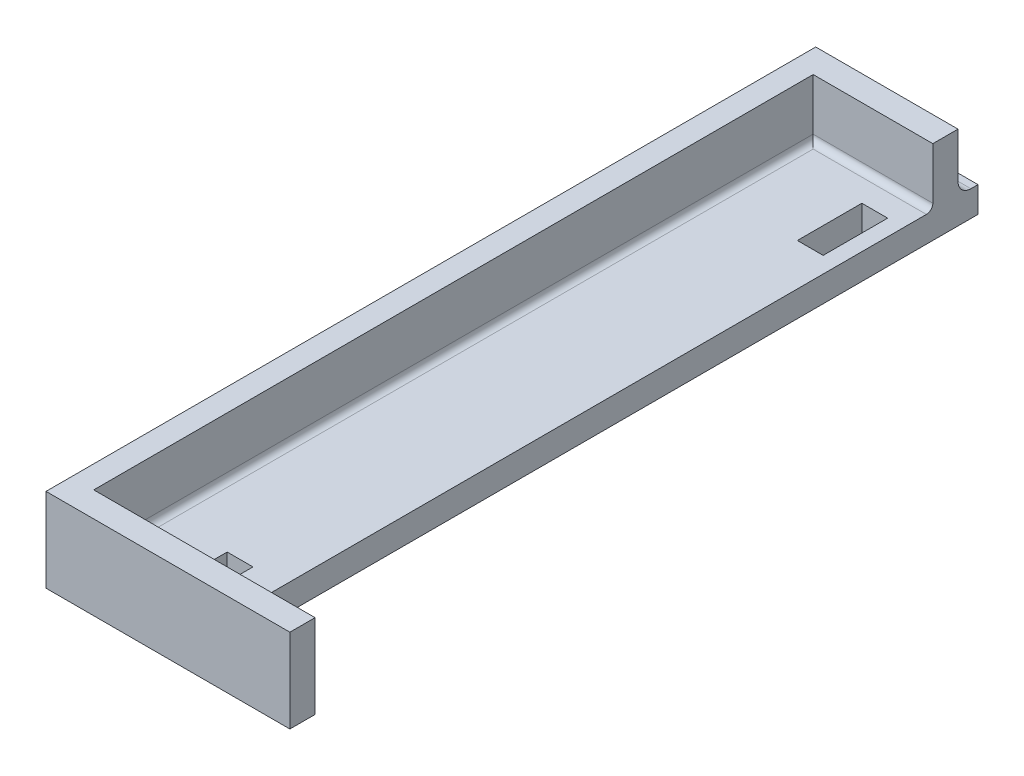
ISO-10303-21;
HEADER;
FILE_DESCRIPTION(('STEP AP214'),'2;1');
FILE_NAME('part.step','',(''),(''),'','','');
FILE_SCHEMA(('AUTOMOTIVE_DESIGN { 1 0 10303 214 1 1 1 1 }'));
ENDSEC;
DATA;
#1=APPLICATION_CONTEXT('core data for automotive mechanical design processes');
#2=APPLICATION_PROTOCOL_DEFINITION('international standard','automotive_design',2000,#1);
#3=PRODUCT_CONTEXT('',#1,'mechanical');
#4=PRODUCT('Part','Part','',(#3));
#5=PRODUCT_RELATED_PRODUCT_CATEGORY('part','',(#4));
#6=PRODUCT_DEFINITION_FORMATION('','',#4);
#7=PRODUCT_DEFINITION_CONTEXT('part definition',#1,'design');
#8=PRODUCT_DEFINITION('design','',#6,#7);
#9=PRODUCT_DEFINITION_SHAPE('','',#8);
#10=(LENGTH_UNIT() NAMED_UNIT(*) SI_UNIT(.MILLI.,.METRE.));
#11=(NAMED_UNIT(*) PLANE_ANGLE_UNIT() SI_UNIT($,.RADIAN.));
#12=(NAMED_UNIT(*) SI_UNIT($,.STERADIAN.) SOLID_ANGLE_UNIT());
#13=UNCERTAINTY_MEASURE_WITH_UNIT(LENGTH_MEASURE(1.E-05),#10,'distance_accuracy_value','');
#14=(GEOMETRIC_REPRESENTATION_CONTEXT(3) GLOBAL_UNCERTAINTY_ASSIGNED_CONTEXT((#13)) GLOBAL_UNIT_ASSIGNED_CONTEXT((#10,
#11,#12)) REPRESENTATION_CONTEXT('',''));
#15=CARTESIAN_POINT('',(0.,0.,0.));
#16=DIRECTION('',(0.,0.,1.));
#17=DIRECTION('',(1.,0.,0.));
#18=AXIS2_PLACEMENT_3D('',#15,#16,#17);
#19=CARTESIAN_POINT('',(-15.75,-4.,-132.4));
#20=DIRECTION('',(1.,0.,0.));
#21=DIRECTION('',(0.,0.,1.));
#22=AXIS2_PLACEMENT_3D('',#19,#20,#21);
#23=PLANE('',#22);
#24=DIRECTION('',(0.,0.,1.));
#25=VECTOR('',#24,1.);
#26=CARTESIAN_POINT('',(-15.75,0.,-132.4));
#27=LINE('',#26,#25);
#28=CARTESIAN_POINT('',(-15.75,0.,-122.4));
#29=VERTEX_POINT('',#28);
#30=CARTESIAN_POINT('',(-15.75,0.,-121.3));
#31=VERTEX_POINT('',#30);
#32=EDGE_CURVE('E189',#29,#31,#27,.T.);
#33=ORIENTED_EDGE('',*,*,#32,.T.);
#34=CARTESIAN_POINT('',(-15.75,2.,-121.3));
#35=DIRECTION('',(-1.,0.,0.));
#36=DIRECTION('',(0.,0.,1.));
#37=AXIS2_PLACEMENT_3D('',#34,#35,#36);
#38=CIRCLE('',#37,2.);
#39=CARTESIAN_POINT('',(-15.75,2.,-119.3));
#40=VERTEX_POINT('',#39);
#41=EDGE_CURVE('E229',#31,#40,#38,.T.);
#42=ORIENTED_EDGE('',*,*,#41,.T.);
#43=DIRECTION('',(0.,-1.,0.));
#44=VECTOR('',#43,1.);
#45=CARTESIAN_POINT('',(-15.75,9.,-119.3));
#46=LINE('',#45,#44);
#47=CARTESIAN_POINT('',(-15.75,9.,-119.3));
#48=VERTEX_POINT('',#47);
#49=EDGE_CURVE('E208',#48,#40,#46,.T.);
#50=ORIENTED_EDGE('',*,*,#49,.F.);
#51=DIRECTION('',(0.,0.,1.));
#52=VECTOR('',#51,1.);
#53=CARTESIAN_POINT('',(-15.75,9.,-115.4));
#54=LINE('',#53,#52);
#55=CARTESIAN_POINT('',(-15.75,9.,-115.4));
#56=VERTEX_POINT('',#55);
#57=EDGE_CURVE('E321',#48,#56,#54,.T.);
#58=ORIENTED_EDGE('',*,*,#57,.T.);
#59=DIRECTION('',(0.,-1.,0.));
#60=VECTOR('',#59,1.);
#61=CARTESIAN_POINT('',(-15.75,9.,-115.4));
#62=LINE('',#61,#60);
#63=CARTESIAN_POINT('',(-15.75,1.,-115.4));
#64=VERTEX_POINT('',#63);
#65=EDGE_CURVE('E282',#56,#64,#62,.T.);
#66=ORIENTED_EDGE('',*,*,#65,.T.);
#67=CARTESIAN_POINT('',(-15.75,1.,-114.4));
#68=DIRECTION('',(-1.,0.,0.));
#69=DIRECTION('',(0.,0.,1.));
#70=AXIS2_PLACEMENT_3D('',#67,#68,#69);
#71=CIRCLE('',#70,1.);
#72=CARTESIAN_POINT('',(-15.75,0.,-114.4));
#73=VERTEX_POINT('',#72);
#74=EDGE_CURVE('E43',#64,#73,#71,.T.);
#75=ORIENTED_EDGE('',*,*,#74,.T.);
#76=CARTESIAN_POINT('',(-15.75,0.,-4.90000000000002));
#77=VERTEX_POINT('',#76);
#78=EDGE_CURVE('E203',#73,#77,#27,.T.);
#79=ORIENTED_EDGE('',*,*,#78,.T.);
#80=CARTESIAN_POINT('',(-15.75,1.,-4.9));
#81=DIRECTION('',(-1.,0.,0.));
#82=DIRECTION('',(0.,0.,1.));
#83=AXIS2_PLACEMENT_3D('',#80,#81,#82);
#84=CIRCLE('',#83,1.);
#85=CARTESIAN_POINT('',(-15.75,1.,-3.90000000000001));
#86=VERTEX_POINT('',#85);
#87=EDGE_CURVE('E269',#77,#86,#84,.T.);
#88=ORIENTED_EDGE('',*,*,#87,.T.);
#89=DIRECTION('',(0.,1.,0.));
#90=VECTOR('',#89,1.);
#91=CARTESIAN_POINT('',(-15.75,-4.,-3.9));
#92=LINE('',#91,#90);
#93=CARTESIAN_POINT('',(-15.75,-4.,-3.9));
#94=VERTEX_POINT('',#93);
#95=EDGE_CURVE('E297',#94,#86,#92,.T.);
#96=ORIENTED_EDGE('',*,*,#95,.F.);
#97=DIRECTION('',(0.,0.,1.));
#98=VECTOR('',#97,1.);
#99=CARTESIAN_POINT('',(-15.75,-4.,-132.4));
#100=LINE('',#99,#98);
#101=CARTESIAN_POINT('',(-15.75,-4.,-122.4));
#102=VERTEX_POINT('',#101);
#103=EDGE_CURVE('E299',#102,#94,#100,.T.);
#104=ORIENTED_EDGE('',*,*,#103,.F.);
#105=DIRECTION('',(0.,-1.,0.));
#106=VECTOR('',#105,1.);
#107=CARTESIAN_POINT('',(-15.75,-4.,-122.4));
#108=LINE('',#107,#106);
#109=EDGE_CURVE('E197',#29,#102,#108,.T.);
#110=ORIENTED_EDGE('',*,*,#109,.F.);
#111=EDGE_LOOP('',(#33,#42,#50,#58,#66,#75,#79,#88,#96,#104,#110));
#112=FACE_BOUND('',#111,.T.);
#113=ADVANCED_FACE('F35',(#112),#23,.T.);
#114=CARTESIAN_POINT('',(-37.8,-4.,-129.4));
#115=DIRECTION('',(-1.,0.,0.));
#116=DIRECTION('',(0.,0.,-1.));
#117=AXIS2_PLACEMENT_3D('',#114,#115,#116);
#118=PLANE('',#117);
#119=DIRECTION('',(0.,0.,-1.));
#120=VECTOR('',#119,1.);
#121=CARTESIAN_POINT('',(-37.8,-4.,0.));
#122=LINE('',#121,#120);
#123=CARTESIAN_POINT('',(-37.8,-4.,0.));
#124=VERTEX_POINT('',#123);
#125=CARTESIAN_POINT('',(-37.8,-4.,-122.4));
#126=VERTEX_POINT('',#125);
#127=EDGE_CURVE('E336',#124,#126,#122,.T.);
#128=ORIENTED_EDGE('',*,*,#127,.F.);
#129=DIRECTION('',(0.,1.,0.));
#130=VECTOR('',#129,1.);
#131=CARTESIAN_POINT('',(-37.8,-4.,0.));
#132=LINE('',#131,#130);
#133=CARTESIAN_POINT('',(-37.8,9.,0.));
#134=VERTEX_POINT('',#133);
#135=EDGE_CURVE('E222',#124,#134,#132,.T.);
#136=ORIENTED_EDGE('',*,*,#135,.T.);
#137=DIRECTION('',(0.,0.,-1.));
#138=VECTOR('',#137,1.);
#139=CARTESIAN_POINT('',(-37.8,9.,-119.3));
#140=LINE('',#139,#138);
#141=CARTESIAN_POINT('',(-37.8,9.,-119.3));
#142=VERTEX_POINT('',#141);
#143=EDGE_CURVE('E316',#134,#142,#140,.T.);
#144=ORIENTED_EDGE('',*,*,#143,.T.);
#145=DIRECTION('',(0.,-1.,0.));
#146=VECTOR('',#145,1.);
#147=CARTESIAN_POINT('',(-37.8,9.,-119.3));
#148=LINE('',#147,#146);
#149=CARTESIAN_POINT('',(-37.8,2.,-119.3));
#150=VERTEX_POINT('',#149);
#151=EDGE_CURVE('E204',#142,#150,#148,.T.);
#152=ORIENTED_EDGE('',*,*,#151,.T.);
#153=CARTESIAN_POINT('',(-37.8,2.,-121.3));
#154=DIRECTION('',(1.,0.,0.));
#155=DIRECTION('',(0.,0.,-1.));
#156=AXIS2_PLACEMENT_3D('',#153,#154,#155);
#157=CIRCLE('',#156,2.);
#158=CARTESIAN_POINT('',(-37.8,0.,-121.3));
#159=VERTEX_POINT('',#158);
#160=EDGE_CURVE('E202',#150,#159,#157,.T.);
#161=ORIENTED_EDGE('',*,*,#160,.T.);
#162=DIRECTION('',(0.,0.,-1.));
#163=VECTOR('',#162,1.);
#164=CARTESIAN_POINT('',(-37.8,0.,-129.4));
#165=LINE('',#164,#163);
#166=CARTESIAN_POINT('',(-37.8,0.,-122.4));
#167=VERTEX_POINT('',#166);
#168=EDGE_CURVE('E186',#159,#167,#165,.T.);
#169=ORIENTED_EDGE('',*,*,#168,.T.);
#170=DIRECTION('',(0.,1.,0.));
#171=VECTOR('',#170,1.);
#172=CARTESIAN_POINT('',(-37.8,-4.,-122.4));
#173=LINE('',#172,#171);
#174=EDGE_CURVE('E191',#126,#167,#173,.T.);
#175=ORIENTED_EDGE('',*,*,#174,.F.);
#176=EDGE_LOOP('',(#128,#136,#144,#152,#161,#169,#175));
#177=FACE_BOUND('',#176,.T.);
#178=ADVANCED_FACE('F199',(#177),#118,.T.);
#179=CARTESIAN_POINT('',(0.,-4.,0.));
#180=DIRECTION('',(0.,1.,0.));
#181=DIRECTION('',(0.,0.,1.));
#182=AXIS2_PLACEMENT_3D('',#179,#180,#181);
#183=PLANE('',#182);
#184=DIRECTION('',(1.,0.,0.));
#185=VECTOR('',#184,1.);
#186=CARTESIAN_POINT('',(0.,-4.,-14.9));
#187=LINE('',#186,#185);
#188=CARTESIAN_POINT('',(-24.6202204130949,-4.,-14.9));
#189=VERTEX_POINT('',#188);
#190=CARTESIAN_POINT('',(-20.6202204130949,-4.,-14.9));
#191=VERTEX_POINT('',#190);
#192=EDGE_CURVE('E238',#189,#191,#187,.T.);
#193=ORIENTED_EDGE('',*,*,#192,.F.);
#194=DIRECTION('',(-4.42680325529367E-05,0.,-0.999999999020171));
#195=VECTOR('',#194,1.);
#196=CARTESIAN_POINT('',(-24.6195607711632,-4.,0.00108985951872473));
#197=LINE('',#196,#195);
#198=CARTESIAN_POINT('',(-24.6197795869051,-4.,-4.9418843150546));
#199=VERTEX_POINT('',#198);
#200=EDGE_CURVE('E235',#199,#189,#197,.T.);
#201=ORIENTED_EDGE('',*,*,#200,.F.);
#202=DIRECTION('',(-1.,0.,0.));
#203=VECTOR('',#202,1.);
#204=CARTESIAN_POINT('',(0.,-4.,-4.9418843150546));
#205=LINE('',#204,#203);
#206=CARTESIAN_POINT('',(-20.6197795869051,-4.,-4.9418843150546));
#207=VERTEX_POINT('',#206);
#208=EDGE_CURVE('E232',#207,#199,#205,.T.);
#209=ORIENTED_EDGE('',*,*,#208,.F.);
#210=DIRECTION('',(4.42680325529367E-05,0.,0.999999999020171));
#211=VECTOR('',#210,1.);
#212=CARTESIAN_POINT('',(-20.6195607790019,-4.,0.000912787388686487));
#213=LINE('',#212,#211);
#214=EDGE_CURVE('E241',#191,#207,#213,.T.);
#215=ORIENTED_EDGE('',*,*,#214,.F.);
#216=EDGE_LOOP('',(#193,#201,#209,#215));
#217=FACE_BOUND('',#216,.T.);
#218=DIRECTION('',(-1.,0.,0.));
#219=VECTOR('',#218,1.);
#220=CARTESIAN_POINT('',(0.,-4.,-100.9));
#221=LINE('',#220,#219);
#222=CARTESIAN_POINT('',(-18.25,-4.,-100.9));
#223=VERTEX_POINT('',#222);
#224=CARTESIAN_POINT('',(-22.25,-4.,-100.9));
#225=VERTEX_POINT('',#224);
#226=EDGE_CURVE('E250',#223,#225,#221,.T.);
#227=ORIENTED_EDGE('',*,*,#226,.F.);
#228=DIRECTION('',(0.,0.,1.));
#229=VECTOR('',#228,1.);
#230=CARTESIAN_POINT('',(-18.25,-4.,0.));
#231=LINE('',#230,#229);
#232=CARTESIAN_POINT('',(-18.25,-4.,-110.9));
#233=VERTEX_POINT('',#232);
#234=EDGE_CURVE('E247',#233,#223,#231,.T.);
#235=ORIENTED_EDGE('',*,*,#234,.F.);
#236=DIRECTION('',(1.,0.,0.));
#237=VECTOR('',#236,1.);
#238=CARTESIAN_POINT('',(0.,-4.,-110.9));
#239=LINE('',#238,#237);
#240=CARTESIAN_POINT('',(-22.25,-4.,-110.9));
#241=VERTEX_POINT('',#240);
#242=EDGE_CURVE('E244',#241,#233,#239,.T.);
#243=ORIENTED_EDGE('',*,*,#242,.F.);
#244=DIRECTION('',(0.,0.,-1.));
#245=VECTOR('',#244,1.);
#246=CARTESIAN_POINT('',(-22.25,-4.,0.));
#247=LINE('',#246,#245);
#248=EDGE_CURVE('E253',#225,#241,#247,.T.);
#249=ORIENTED_EDGE('',*,*,#248,.F.);
#250=EDGE_LOOP('',(#227,#235,#243,#249));
#251=FACE_BOUND('',#250,.T.);
#252=DIRECTION('',(1.,0.,0.));
#253=VECTOR('',#252,1.);
#254=CARTESIAN_POINT('',(0.,-4.,-122.4));
#255=LINE('',#254,#253);
#256=EDGE_CURVE('E193',#126,#102,#255,.T.);
#257=ORIENTED_EDGE('',*,*,#256,.T.);
#258=ORIENTED_EDGE('',*,*,#103,.T.);
#259=DIRECTION('',(1.,0.,0.));
#260=VECTOR('',#259,1.);
#261=CARTESIAN_POINT('',(0.,-4.,-3.9));
#262=LINE('',#261,#260);
#263=CARTESIAN_POINT('',(0.,-4.,-3.9));
#264=VERTEX_POINT('',#263);
#265=EDGE_CURVE('E338',#94,#264,#262,.T.);
#266=ORIENTED_EDGE('',*,*,#265,.T.);
#267=DIRECTION('',(0.,0.,1.));
#268=VECTOR('',#267,1.);
#269=CARTESIAN_POINT('',(0.,-4.,0.));
#270=LINE('',#269,#268);
#271=CARTESIAN_POINT('',(0.,-4.,0.));
#272=VERTEX_POINT('',#271);
#273=EDGE_CURVE('E211',#264,#272,#270,.T.);
#274=ORIENTED_EDGE('',*,*,#273,.T.);
#275=DIRECTION('',(-1.,0.,0.));
#276=VECTOR('',#275,1.);
#277=CARTESIAN_POINT('',(0.,-4.,0.));
#278=LINE('',#277,#276);
#279=EDGE_CURVE('E214',#272,#124,#278,.T.);
#280=ORIENTED_EDGE('',*,*,#279,.T.);
#281=ORIENTED_EDGE('',*,*,#127,.T.);
#282=EDGE_LOOP('',(#257,#258,#266,#274,#280,#281));
#283=FACE_BOUND('',#282,.T.);
#284=ADVANCED_FACE('F343',(#217,#251,#283),#183,.F.);
#285=CARTESIAN_POINT('',(0.,0.,0.));
#286=DIRECTION('',(0.,1.,0.));
#287=DIRECTION('',(0.,0.,1.));
#288=AXIS2_PLACEMENT_3D('',#285,#286,#287);
#289=PLANE('',#288);
#290=ORIENTED_EDGE('',*,*,#168,.F.);
#291=DIRECTION('',(1.,0.,0.));
#292=VECTOR('',#291,1.);
#293=CARTESIAN_POINT('',(0.,0.,-121.3));
#294=LINE('',#293,#292);
#295=EDGE_CURVE('E226',#31,#159,#294,.F.);
#296=ORIENTED_EDGE('',*,*,#295,.F.);
#297=ORIENTED_EDGE('',*,*,#32,.F.);
#298=DIRECTION('',(1.,0.,0.));
#299=VECTOR('',#298,1.);
#300=CARTESIAN_POINT('',(0.,0.,-122.4));
#301=LINE('',#300,#299);
#302=EDGE_CURVE('E11',#167,#29,#301,.T.);
#303=ORIENTED_EDGE('',*,*,#302,.F.);
#304=EDGE_LOOP('',(#290,#296,#297,#303));
#305=FACE_BOUND('',#304,.T.);
#306=ADVANCED_FACE('F184',(#305),#289,.T.);
#307=CARTESIAN_POINT('',(-33.3,1.,0.));
#308=DIRECTION('',(0.,0.,-1.));
#309=DIRECTION('',(1.,0.,0.));
#310=AXIS2_PLACEMENT_3D('',#307,#308,#309);
#311=CYLINDRICAL_SURFACE('',#310,1.);
#312=CARTESIAN_POINT('',(-33.3,1.,-114.4));
#313=DIRECTION('',(-0.707106781186548,0.,0.707106781186547));
#314=DIRECTION('',(-0.707106781186547,0.,-0.707106781186548));
#315=AXIS2_PLACEMENT_3D('',#312,#313,#314);
#316=ELLIPSE('',#315,1.41421356237309,1.);
#317=CARTESIAN_POINT('',(-33.3,0.,-114.4));
#318=VERTEX_POINT('',#317);
#319=CARTESIAN_POINT('',(-34.3,1.,-115.4));
#320=VERTEX_POINT('',#319);
#321=EDGE_CURVE('E275',#318,#320,#316,.F.);
#322=ORIENTED_EDGE('',*,*,#321,.T.);
#323=DIRECTION('',(0.,0.,-1.));
#324=VECTOR('',#323,1.);
#325=CARTESIAN_POINT('',(-34.3,0.999999999999999,-115.4));
#326=LINE('',#325,#324);
#327=CARTESIAN_POINT('',(-34.3,1.,-3.9));
#328=VERTEX_POINT('',#327);
#329=EDGE_CURVE('E265',#320,#328,#326,.F.);
#330=ORIENTED_EDGE('',*,*,#329,.T.);
#331=CARTESIAN_POINT('',(-33.3,1.,-4.9));
#332=DIRECTION('',(-0.707106781186547,0.,-0.707106781186548));
#333=DIRECTION('',(0.707106781186548,0.,-0.707106781186547));
#334=AXIS2_PLACEMENT_3D('',#331,#332,#333);
#335=ELLIPSE('',#334,1.4142135623731,1.);
#336=CARTESIAN_POINT('',(-33.3,0.,-4.9));
#337=VERTEX_POINT('',#336);
#338=EDGE_CURVE('E272',#337,#328,#335,.T.);
#339=ORIENTED_EDGE('',*,*,#338,.F.);
#340=DIRECTION('',(0.,0.,-1.));
#341=VECTOR('',#340,1.);
#342=CARTESIAN_POINT('',(-33.3,0.,0.));
#343=LINE('',#342,#341);
#344=EDGE_CURVE('E258',#337,#318,#343,.T.);
#345=ORIENTED_EDGE('',*,*,#344,.T.);
#346=EDGE_LOOP('',(#322,#330,#339,#345));
#347=FACE_BOUND('',#346,.T.);
#348=ADVANCED_FACE('F433',(#347),#311,.F.);
#349=CARTESIAN_POINT('',(0.,1.,-4.9));
#350=DIRECTION('',(1.,0.,0.));
#351=DIRECTION('',(0.,0.,1.));
#352=AXIS2_PLACEMENT_3D('',#349,#350,#351);
#353=CYLINDRICAL_SURFACE('',#352,1.);
#354=ORIENTED_EDGE('',*,*,#338,.T.);
#355=DIRECTION('',(-1.,0.,0.));
#356=VECTOR('',#355,1.);
#357=CARTESIAN_POINT('',(0.,1.,-3.9));
#358=LINE('',#357,#356);
#359=EDGE_CURVE('E263',#328,#86,#358,.F.);
#360=ORIENTED_EDGE('',*,*,#359,.T.);
#361=ORIENTED_EDGE('',*,*,#87,.F.);
#362=DIRECTION('',(-1.,0.,0.));
#363=VECTOR('',#362,1.);
#364=CARTESIAN_POINT('',(0.,0.,-4.9));
#365=LINE('',#364,#363);
#366=EDGE_CURVE('E261',#77,#337,#365,.T.);
#367=ORIENTED_EDGE('',*,*,#366,.T.);
#368=EDGE_LOOP('',(#354,#360,#361,#367));
#369=FACE_BOUND('',#368,.T.);
#370=ADVANCED_FACE('F292',(#369),#353,.F.);
#371=CARTESIAN_POINT('',(0.,1.,-114.4));
#372=DIRECTION('',(1.,0.,0.));
#373=DIRECTION('',(0.,0.,1.));
#374=AXIS2_PLACEMENT_3D('',#371,#372,#373);
#375=CYLINDRICAL_SURFACE('',#374,1.);
#376=DIRECTION('',(1.,0.,0.));
#377=VECTOR('',#376,1.);
#378=CARTESIAN_POINT('',(0.,0.,-114.4));
#379=LINE('',#378,#377);
#380=EDGE_CURVE('E256',#318,#73,#379,.T.);
#381=ORIENTED_EDGE('',*,*,#380,.T.);
#382=ORIENTED_EDGE('',*,*,#74,.F.);
#383=DIRECTION('',(1.,0.,0.));
#384=VECTOR('',#383,1.);
#385=CARTESIAN_POINT('',(-34.3,0.999999999999999,-115.4));
#386=LINE('',#385,#384);
#387=EDGE_CURVE('E56',#64,#320,#386,.F.);
#388=ORIENTED_EDGE('',*,*,#387,.T.);
#389=ORIENTED_EDGE('',*,*,#321,.F.);
#390=EDGE_LOOP('',(#381,#382,#388,#389));
#391=FACE_BOUND('',#390,.T.);
#392=ADVANCED_FACE('F37',(#391),#375,.F.);
#393=CARTESIAN_POINT('',(0.,-4.,-3.9));
#394=DIRECTION('',(0.,0.,-1.));
#395=DIRECTION('',(1.,0.,0.));
#396=AXIS2_PLACEMENT_3D('',#393,#394,#395);
#397=PLANE('',#396);
#398=DIRECTION('',(0.,-1.,0.));
#399=VECTOR('',#398,1.);
#400=CARTESIAN_POINT('',(-34.3,9.,-3.9));
#401=LINE('',#400,#399);
#402=CARTESIAN_POINT('',(-34.3,9.,-3.9));
#403=VERTEX_POINT('',#402);
#404=EDGE_CURVE('E328',#403,#328,#401,.T.);
#405=ORIENTED_EDGE('',*,*,#404,.F.);
#406=DIRECTION('',(1.,0.,0.));
#407=VECTOR('',#406,1.);
#408=CARTESIAN_POINT('',(-34.3,9.,-3.9));
#409=LINE('',#408,#407);
#410=CARTESIAN_POINT('',(0.,9.,-3.9));
#411=VERTEX_POINT('',#410);
#412=EDGE_CURVE('E301',#403,#411,#409,.T.);
#413=ORIENTED_EDGE('',*,*,#412,.T.);
#414=DIRECTION('',(0.,1.,0.));
#415=VECTOR('',#414,1.);
#416=CARTESIAN_POINT('',(0.,-4.,-3.9));
#417=LINE('',#416,#415);
#418=EDGE_CURVE('E219',#264,#411,#417,.T.);
#419=ORIENTED_EDGE('',*,*,#418,.F.);
#420=ORIENTED_EDGE('',*,*,#265,.F.);
#421=ORIENTED_EDGE('',*,*,#95,.T.);
#422=ORIENTED_EDGE('',*,*,#359,.F.);
#423=EDGE_LOOP('',(#405,#413,#419,#420,#421,#422));
#424=FACE_BOUND('',#423,.T.);
#425=ADVANCED_FACE('F423',(#424),#397,.T.);
#426=CARTESIAN_POINT('',(-15.75,2.,-121.3));
#427=DIRECTION('',(1.,0.,0.));
#428=DIRECTION('',(0.,0.,1.));
#429=AXIS2_PLACEMENT_3D('',#426,#427,#428);
#430=CYLINDRICAL_SURFACE('',#429,2.);
#431=DIRECTION('',(1.,0.,0.));
#432=VECTOR('',#431,1.);
#433=CARTESIAN_POINT('',(-15.75,2.,-119.3));
#434=LINE('',#433,#432);
#435=EDGE_CURVE('E218',#150,#40,#434,.T.);
#436=ORIENTED_EDGE('',*,*,#435,.T.);
#437=ORIENTED_EDGE('',*,*,#41,.F.);
#438=ORIENTED_EDGE('',*,*,#295,.T.);
#439=ORIENTED_EDGE('',*,*,#160,.F.);
#440=EDGE_LOOP('',(#436,#437,#438,#439));
#441=FACE_BOUND('',#440,.T.);
#442=ADVANCED_FACE('F428',(#441),#430,.F.);
#443=DIRECTION('',(0.,0.,-1.));
#444=VECTOR('',#443,1.);
#445=CARTESIAN_POINT('',(-22.25,0.,-110.9));
#446=LINE('',#445,#444);
#447=CARTESIAN_POINT('',(-22.25,0.,-100.9));
#448=VERTEX_POINT('',#447);
#449=CARTESIAN_POINT('',(-22.25,0.,-110.9));
#450=VERTEX_POINT('',#449);
#451=EDGE_CURVE('E356',#448,#450,#446,.T.);
#452=ORIENTED_EDGE('',*,*,#451,.T.);
#453=DIRECTION('',(1.,0.,0.));
#454=VECTOR('',#453,1.);
#455=CARTESIAN_POINT('',(-18.25,0.,-110.9));
#456=LINE('',#455,#454);
#457=CARTESIAN_POINT('',(-18.25,0.,-110.9));
#458=VERTEX_POINT('',#457);
#459=EDGE_CURVE('E359',#450,#458,#456,.T.);
#460=ORIENTED_EDGE('',*,*,#459,.T.);
#461=DIRECTION('',(0.,0.,1.));
#462=VECTOR('',#461,1.);
#463=CARTESIAN_POINT('',(-18.25,0.,-100.9));
#464=LINE('',#463,#462);
#465=CARTESIAN_POINT('',(-18.25,0.,-100.9));
#466=VERTEX_POINT('',#465);
#467=EDGE_CURVE('E363',#458,#466,#464,.T.);
#468=ORIENTED_EDGE('',*,*,#467,.T.);
#469=DIRECTION('',(-1.,0.,0.));
#470=VECTOR('',#469,1.);
#471=CARTESIAN_POINT('',(-18.25,0.,-100.9));
#472=LINE('',#471,#470);
#473=EDGE_CURVE('E366',#466,#448,#472,.T.);
#474=ORIENTED_EDGE('',*,*,#473,.T.);
#475=EDGE_LOOP('',(#452,#460,#468,#474));
#476=FACE_BOUND('',#475,.T.);
#477=DIRECTION('',(4.42680325529367E-05,0.,0.999999999020171));
#478=VECTOR('',#477,1.);
#479=CARTESIAN_POINT('',(-20.6197795869051,0.,-4.9418843150546));
#480=LINE('',#479,#478);
#481=CARTESIAN_POINT('',(-20.6202204130949,0.,-14.9));
#482=VERTEX_POINT('',#481);
#483=CARTESIAN_POINT('',(-20.6197795869051,0.,-4.9418843150546));
#484=VERTEX_POINT('',#483);
#485=EDGE_CURVE('E352',#482,#484,#480,.T.);
#486=ORIENTED_EDGE('',*,*,#485,.T.);
#487=DIRECTION('',(-1.,0.,0.));
#488=VECTOR('',#487,1.);
#489=CARTESIAN_POINT('',(-24.6197795869051,0.,-4.9418843150546));
#490=LINE('',#489,#488);
#491=CARTESIAN_POINT('',(-24.6197795869051,0.,-4.9418843150546));
#492=VERTEX_POINT('',#491);
#493=EDGE_CURVE('E376',#484,#492,#490,.T.);
#494=ORIENTED_EDGE('',*,*,#493,.T.);
#495=DIRECTION('',(-4.42680325529367E-05,0.,-0.999999999020171));
#496=VECTOR('',#495,1.);
#497=CARTESIAN_POINT('',(-24.6202204130949,0.,-14.9));
#498=LINE('',#497,#496);
#499=CARTESIAN_POINT('',(-24.6202204130949,0.,-14.9));
#500=VERTEX_POINT('',#499);
#501=EDGE_CURVE('E379',#492,#500,#498,.T.);
#502=ORIENTED_EDGE('',*,*,#501,.T.);
#503=DIRECTION('',(1.,0.,0.));
#504=VECTOR('',#503,1.);
#505=CARTESIAN_POINT('',(-20.6202204130949,0.,-14.9));
#506=LINE('',#505,#504);
#507=EDGE_CURVE('E382',#500,#482,#506,.T.);
#508=ORIENTED_EDGE('',*,*,#507,.T.);
#509=EDGE_LOOP('',(#486,#494,#502,#508));
#510=FACE_BOUND('',#509,.T.);
#511=ORIENTED_EDGE('',*,*,#78,.F.);
#512=ORIENTED_EDGE('',*,*,#380,.F.);
#513=ORIENTED_EDGE('',*,*,#344,.F.);
#514=ORIENTED_EDGE('',*,*,#366,.F.);
#515=EDGE_LOOP('',(#511,#512,#513,#514));
#516=FACE_BOUND('',#515,.T.);
#517=ADVANCED_FACE('F288',(#476,#510,#516),#289,.T.);
#518=CARTESIAN_POINT('',(0.,-4.,0.));
#519=DIRECTION('',(0.,0.,1.));
#520=DIRECTION('',(-1.,0.,0.));
#521=AXIS2_PLACEMENT_3D('',#518,#519,#520);
#522=PLANE('',#521);
#523=ORIENTED_EDGE('',*,*,#135,.F.);
#524=ORIENTED_EDGE('',*,*,#279,.F.);
#525=DIRECTION('',(0.,1.,0.));
#526=VECTOR('',#525,1.);
#527=CARTESIAN_POINT('',(0.,-4.,0.));
#528=LINE('',#527,#526);
#529=CARTESIAN_POINT('',(0.,9.,0.));
#530=VERTEX_POINT('',#529);
#531=EDGE_CURVE('E215',#272,#530,#528,.T.);
#532=ORIENTED_EDGE('',*,*,#531,.T.);
#533=DIRECTION('',(-1.,0.,0.));
#534=VECTOR('',#533,1.);
#535=CARTESIAN_POINT('',(0.,9.,0.));
#536=LINE('',#535,#534);
#537=EDGE_CURVE('E314',#530,#134,#536,.T.);
#538=ORIENTED_EDGE('',*,*,#537,.T.);
#539=EDGE_LOOP('',(#523,#524,#532,#538));
#540=FACE_BOUND('',#539,.T.);
#541=ADVANCED_FACE('F350',(#540),#522,.T.);
#542=CARTESIAN_POINT('',(0.,-4.,0.));
#543=DIRECTION('',(1.,0.,0.));
#544=DIRECTION('',(0.,0.,1.));
#545=AXIS2_PLACEMENT_3D('',#542,#543,#544);
#546=PLANE('',#545);
#547=ORIENTED_EDGE('',*,*,#531,.F.);
#548=ORIENTED_EDGE('',*,*,#273,.F.);
#549=ORIENTED_EDGE('',*,*,#418,.T.);
#550=DIRECTION('',(0.,0.,1.));
#551=VECTOR('',#550,1.);
#552=CARTESIAN_POINT('',(0.,9.,-3.9));
#553=LINE('',#552,#551);
#554=EDGE_CURVE('E305',#411,#530,#553,.T.);
#555=ORIENTED_EDGE('',*,*,#554,.T.);
#556=EDGE_LOOP('',(#547,#548,#549,#555));
#557=FACE_BOUND('',#556,.T.);
#558=ADVANCED_FACE('F347',(#557),#546,.T.);
#559=CARTESIAN_POINT('',(-15.75,9.,-119.3));
#560=DIRECTION('',(0.,0.,1.));
#561=DIRECTION('',(-1.,0.,0.));
#562=AXIS2_PLACEMENT_3D('',#559,#560,#561);
#563=PLANE('',#562);
#564=ORIENTED_EDGE('',*,*,#151,.F.);
#565=DIRECTION('',(1.,0.,0.));
#566=VECTOR('',#565,1.);
#567=CARTESIAN_POINT('',(-15.75,9.,-119.3));
#568=LINE('',#567,#566);
#569=EDGE_CURVE('E319',#142,#48,#568,.T.);
#570=ORIENTED_EDGE('',*,*,#569,.T.);
#571=ORIENTED_EDGE('',*,*,#49,.T.);
#572=ORIENTED_EDGE('',*,*,#435,.F.);
#573=EDGE_LOOP('',(#564,#570,#571,#572));
#574=FACE_BOUND('',#573,.T.);
#575=ADVANCED_FACE('F503',(#574),#563,.F.);
#576=CARTESIAN_POINT('',(-34.3,9.,-115.4));
#577=DIRECTION('',(0.,0.,-1.));
#578=DIRECTION('',(1.,0.,0.));
#579=AXIS2_PLACEMENT_3D('',#576,#577,#578);
#580=PLANE('',#579);
#581=ORIENTED_EDGE('',*,*,#65,.F.);
#582=DIRECTION('',(-1.,0.,0.));
#583=VECTOR('',#582,1.);
#584=CARTESIAN_POINT('',(-34.3,9.,-115.4));
#585=LINE('',#584,#583);
#586=CARTESIAN_POINT('',(-34.3,9.,-115.4));
#587=VERTEX_POINT('',#586);
#588=EDGE_CURVE('E323',#56,#587,#585,.T.);
#589=ORIENTED_EDGE('',*,*,#588,.T.);
#590=DIRECTION('',(0.,-1.,0.));
#591=VECTOR('',#590,1.);
#592=CARTESIAN_POINT('',(-34.3,9.,-115.4));
#593=LINE('',#592,#591);
#594=EDGE_CURVE('E330',#587,#320,#593,.T.);
#595=ORIENTED_EDGE('',*,*,#594,.T.);
#596=ORIENTED_EDGE('',*,*,#387,.F.);
#597=EDGE_LOOP('',(#581,#589,#595,#596));
#598=FACE_BOUND('',#597,.T.);
#599=ADVANCED_FACE('F509',(#598),#580,.F.);
#600=CARTESIAN_POINT('',(-34.3,9.,-115.4));
#601=DIRECTION('',(-1.,0.,0.));
#602=DIRECTION('',(0.,0.,-1.));
#603=AXIS2_PLACEMENT_3D('',#600,#601,#602);
#604=PLANE('',#603);
#605=ORIENTED_EDGE('',*,*,#594,.F.);
#606=DIRECTION('',(0.,0.,1.));
#607=VECTOR('',#606,1.);
#608=CARTESIAN_POINT('',(-34.3,9.,-115.4));
#609=LINE('',#608,#607);
#610=EDGE_CURVE('E326',#587,#403,#609,.T.);
#611=ORIENTED_EDGE('',*,*,#610,.T.);
#612=ORIENTED_EDGE('',*,*,#404,.T.);
#613=ORIENTED_EDGE('',*,*,#329,.F.);
#614=EDGE_LOOP('',(#605,#611,#612,#613));
#615=FACE_BOUND('',#614,.T.);
#616=ADVANCED_FACE('F442',(#615),#604,.F.);
#617=CARTESIAN_POINT('',(0.,9.,0.));
#618=DIRECTION('',(0.,1.,0.));
#619=DIRECTION('',(0.,0.,1.));
#620=AXIS2_PLACEMENT_3D('',#617,#618,#619);
#621=PLANE('',#620);
#622=ORIENTED_EDGE('',*,*,#412,.F.);
#623=ORIENTED_EDGE('',*,*,#610,.F.);
#624=ORIENTED_EDGE('',*,*,#588,.F.);
#625=ORIENTED_EDGE('',*,*,#57,.F.);
#626=ORIENTED_EDGE('',*,*,#569,.F.);
#627=ORIENTED_EDGE('',*,*,#143,.F.);
#628=ORIENTED_EDGE('',*,*,#537,.F.);
#629=ORIENTED_EDGE('',*,*,#554,.F.);
#630=EDGE_LOOP('',(#622,#623,#624,#625,#626,#627,#628,#629));
#631=FACE_BOUND('',#630,.T.);
#632=ADVANCED_FACE('F517',(#631),#621,.T.);
#633=CARTESIAN_POINT('',(-20.6197795869051,-10.,-4.9418843150546));
#634=DIRECTION('',(0.999999999020171,0.,-4.42680325529367E-05));
#635=DIRECTION('',(4.42680325529367E-05,0.,0.999999999020171));
#636=AXIS2_PLACEMENT_3D('',#633,#634,#635);
#637=PLANE('',#636);
#638=DIRECTION('',(0.,1.,0.));
#639=VECTOR('',#638,1.);
#640=CARTESIAN_POINT('',(-20.6202204130949,-10.,-14.9));
#641=LINE('',#640,#639);
#642=EDGE_CURVE('E360',#191,#482,#641,.T.);
#643=ORIENTED_EDGE('',*,*,#642,.F.);
#644=ORIENTED_EDGE('',*,*,#214,.T.);
#645=DIRECTION('',(0.,1.,0.));
#646=VECTOR('',#645,1.);
#647=CARTESIAN_POINT('',(-20.6197795869051,-10.,-4.9418843150546));
#648=LINE('',#647,#646);
#649=EDGE_CURVE('E310',#207,#484,#648,.T.);
#650=ORIENTED_EDGE('',*,*,#649,.T.);
#651=ORIENTED_EDGE('',*,*,#485,.F.);
#652=EDGE_LOOP('',(#643,#644,#650,#651));
#653=FACE_BOUND('',#652,.T.);
#654=ADVANCED_FACE('F393',(#653),#637,.F.);
#655=CARTESIAN_POINT('',(-20.6202204130949,-10.,-14.9));
#656=DIRECTION('',(0.,0.,-1.));
#657=DIRECTION('',(1.,0.,0.));
#658=AXIS2_PLACEMENT_3D('',#655,#656,#657);
#659=PLANE('',#658);
#660=DIRECTION('',(0.,1.,0.));
#661=VECTOR('',#660,1.);
#662=CARTESIAN_POINT('',(-24.6202204130949,-10.,-14.9));
#663=LINE('',#662,#661);
#664=EDGE_CURVE('E386',#189,#500,#663,.T.);
#665=ORIENTED_EDGE('',*,*,#664,.F.);
#666=ORIENTED_EDGE('',*,*,#192,.T.);
#667=ORIENTED_EDGE('',*,*,#642,.T.);
#668=ORIENTED_EDGE('',*,*,#507,.F.);
#669=EDGE_LOOP('',(#665,#666,#667,#668));
#670=FACE_BOUND('',#669,.T.);
#671=ADVANCED_FACE('F400',(#670),#659,.F.);
#672=CARTESIAN_POINT('',(-24.6202204130949,-10.,-14.9));
#673=DIRECTION('',(-0.999999999020171,0.,4.42680325529367E-05));
#674=DIRECTION('',(-4.42680325529367E-05,0.,-0.999999999020171));
#675=AXIS2_PLACEMENT_3D('',#672,#673,#674);
#676=PLANE('',#675);
#677=DIRECTION('',(0.,1.,0.));
#678=VECTOR('',#677,1.);
#679=CARTESIAN_POINT('',(-24.6197795869051,-10.,-4.9418843150546));
#680=LINE('',#679,#678);
#681=EDGE_CURVE('E387',#199,#492,#680,.T.);
#682=ORIENTED_EDGE('',*,*,#681,.F.);
#683=ORIENTED_EDGE('',*,*,#200,.T.);
#684=ORIENTED_EDGE('',*,*,#664,.T.);
#685=ORIENTED_EDGE('',*,*,#501,.F.);
#686=EDGE_LOOP('',(#682,#683,#684,#685));
#687=FACE_BOUND('',#686,.T.);
#688=ADVANCED_FACE('F406',(#687),#676,.F.);
#689=CARTESIAN_POINT('',(-24.6197795869051,-10.,-4.9418843150546));
#690=DIRECTION('',(0.,0.,1.));
#691=DIRECTION('',(-1.,0.,0.));
#692=AXIS2_PLACEMENT_3D('',#689,#690,#691);
#693=PLANE('',#692);
#694=ORIENTED_EDGE('',*,*,#649,.F.);
#695=ORIENTED_EDGE('',*,*,#208,.T.);
#696=ORIENTED_EDGE('',*,*,#681,.T.);
#697=ORIENTED_EDGE('',*,*,#493,.F.);
#698=EDGE_LOOP('',(#694,#695,#696,#697));
#699=FACE_BOUND('',#698,.T.);
#700=ADVANCED_FACE('F396',(#699),#693,.F.);
#701=CARTESIAN_POINT('',(-22.25,-10.,-110.9));
#702=DIRECTION('',(-1.,0.,0.));
#703=DIRECTION('',(0.,0.,-1.));
#704=AXIS2_PLACEMENT_3D('',#701,#702,#703);
#705=PLANE('',#704);
#706=DIRECTION('',(0.,1.,0.));
#707=VECTOR('',#706,1.);
#708=CARTESIAN_POINT('',(-22.25,-10.,-100.9));
#709=LINE('',#708,#707);
#710=EDGE_CURVE('E302',#225,#448,#709,.T.);
#711=ORIENTED_EDGE('',*,*,#710,.F.);
#712=ORIENTED_EDGE('',*,*,#248,.T.);
#713=DIRECTION('',(0.,1.,0.));
#714=VECTOR('',#713,1.);
#715=CARTESIAN_POINT('',(-22.25,-10.,-110.9));
#716=LINE('',#715,#714);
#717=EDGE_CURVE('E368',#241,#450,#716,.T.);
#718=ORIENTED_EDGE('',*,*,#717,.T.);
#719=ORIENTED_EDGE('',*,*,#451,.F.);
#720=EDGE_LOOP('',(#711,#712,#718,#719));
#721=FACE_BOUND('',#720,.T.);
#722=ADVANCED_FACE('F413',(#721),#705,.F.);
#723=CARTESIAN_POINT('',(-18.25,-10.,-100.9));
#724=DIRECTION('',(0.,0.,1.));
#725=DIRECTION('',(-1.,0.,0.));
#726=AXIS2_PLACEMENT_3D('',#723,#724,#725);
#727=PLANE('',#726);
#728=DIRECTION('',(0.,1.,0.));
#729=VECTOR('',#728,1.);
#730=CARTESIAN_POINT('',(-18.25,-10.,-100.9));
#731=LINE('',#730,#729);
#732=EDGE_CURVE('E307',#223,#466,#731,.T.);
#733=ORIENTED_EDGE('',*,*,#732,.F.);
#734=ORIENTED_EDGE('',*,*,#226,.T.);
#735=ORIENTED_EDGE('',*,*,#710,.T.);
#736=ORIENTED_EDGE('',*,*,#473,.F.);
#737=EDGE_LOOP('',(#733,#734,#735,#736));
#738=FACE_BOUND('',#737,.T.);
#739=ADVANCED_FACE('F596',(#738),#727,.F.);
#740=CARTESIAN_POINT('',(-18.25,-10.,-100.9));
#741=DIRECTION('',(1.,0.,0.));
#742=DIRECTION('',(0.,0.,1.));
#743=AXIS2_PLACEMENT_3D('',#740,#741,#742);
#744=PLANE('',#743);
#745=DIRECTION('',(0.,1.,0.));
#746=VECTOR('',#745,1.);
#747=CARTESIAN_POINT('',(-18.25,-10.,-110.9));
#748=LINE('',#747,#746);
#749=EDGE_CURVE('E371',#233,#458,#748,.T.);
#750=ORIENTED_EDGE('',*,*,#749,.F.);
#751=ORIENTED_EDGE('',*,*,#234,.T.);
#752=ORIENTED_EDGE('',*,*,#732,.T.);
#753=ORIENTED_EDGE('',*,*,#467,.F.);
#754=EDGE_LOOP('',(#750,#751,#752,#753));
#755=FACE_BOUND('',#754,.T.);
#756=ADVANCED_FACE('F593',(#755),#744,.F.);
#757=CARTESIAN_POINT('',(-18.25,-10.,-110.9));
#758=DIRECTION('',(0.,0.,-1.));
#759=DIRECTION('',(1.,0.,0.));
#760=AXIS2_PLACEMENT_3D('',#757,#758,#759);
#761=PLANE('',#760);
#762=ORIENTED_EDGE('',*,*,#717,.F.);
#763=ORIENTED_EDGE('',*,*,#242,.T.);
#764=ORIENTED_EDGE('',*,*,#749,.T.);
#765=ORIENTED_EDGE('',*,*,#459,.F.);
#766=EDGE_LOOP('',(#762,#763,#764,#765));
#767=FACE_BOUND('',#766,.T.);
#768=ADVANCED_FACE('F589',(#767),#761,.F.);
#769=CARTESIAN_POINT('',(0.,0.,-122.4));
#770=DIRECTION('',(0.,0.,-1.));
#771=DIRECTION('',(1.,0.,0.));
#772=AXIS2_PLACEMENT_3D('',#769,#770,#771);
#773=PLANE('',#772);
#774=ORIENTED_EDGE('',*,*,#256,.F.);
#775=ORIENTED_EDGE('',*,*,#174,.T.);
#776=ORIENTED_EDGE('',*,*,#302,.T.);
#777=ORIENTED_EDGE('',*,*,#109,.T.);
#778=EDGE_LOOP('',(#774,#775,#776,#777));
#779=FACE_BOUND('',#778,.T.);
#780=ADVANCED_FACE('F192',(#779),#773,.T.);
#781=CLOSED_SHELL('',(#113,#178,#284,#306,#348,#370,#392,#425,#442,#517,#541,#558,#575,#599,
#616,#632,#654,#671,#688,#700,#722,#739,#756,#768,#780));
#782=MANIFOLD_SOLID_BREP('B2',#781);
#783=ADVANCED_BREP_SHAPE_REPRESENTATION('',(#18,#782),#14);
#784=SHAPE_DEFINITION_REPRESENTATION(#9,#783);
ENDSEC;
END-ISO-10303-21;
